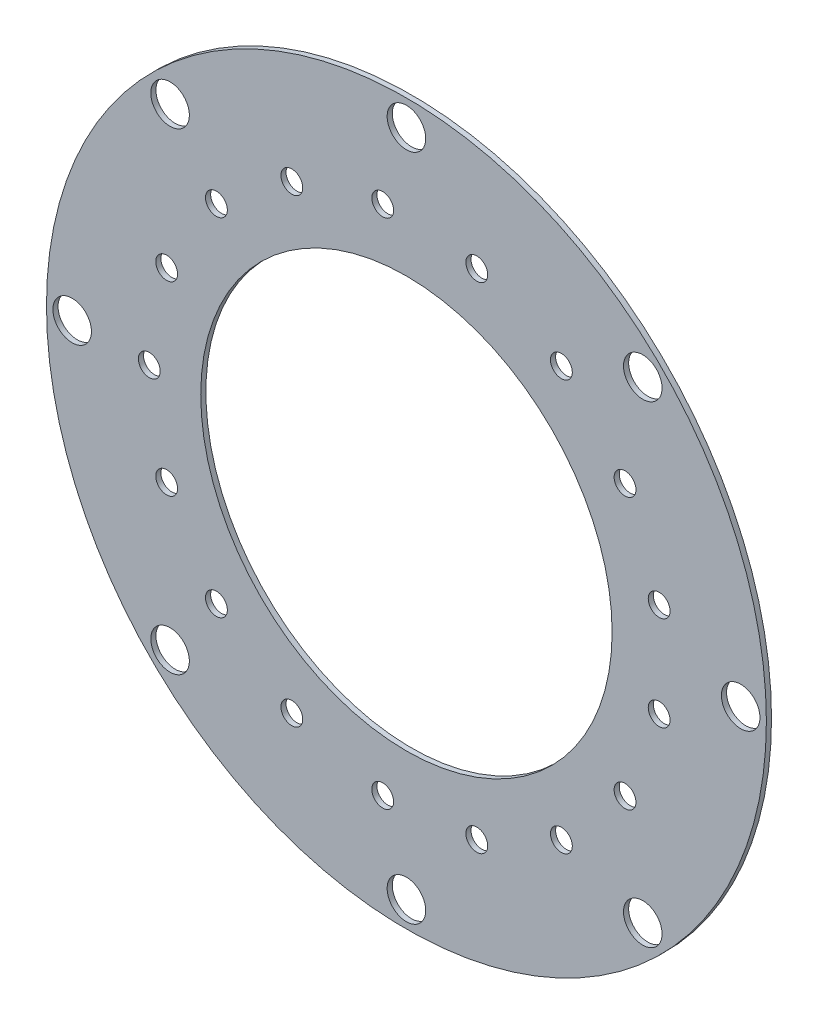
ISO-10303-21;
HEADER;
FILE_DESCRIPTION(('STEP AP214'),'2;1');
FILE_NAME('part.step','',(''),(''),'','','');
FILE_SCHEMA(('AUTOMOTIVE_DESIGN { 1 0 10303 214 1 1 1 1 }'));
ENDSEC;
DATA;
#1=APPLICATION_CONTEXT('core data for automotive mechanical design processes');
#2=APPLICATION_PROTOCOL_DEFINITION('international standard','automotive_design',2000,#1);
#3=PRODUCT_CONTEXT('',#1,'mechanical');
#4=PRODUCT('Part','Part','',(#3));
#5=PRODUCT_RELATED_PRODUCT_CATEGORY('part','',(#4));
#6=PRODUCT_DEFINITION_FORMATION('','',#4);
#7=PRODUCT_DEFINITION_CONTEXT('part definition',#1,'design');
#8=PRODUCT_DEFINITION('design','',#6,#7);
#9=PRODUCT_DEFINITION_SHAPE('','',#8);
#10=(LENGTH_UNIT() NAMED_UNIT(*) SI_UNIT(.MILLI.,.METRE.));
#11=(NAMED_UNIT(*) PLANE_ANGLE_UNIT() SI_UNIT($,.RADIAN.));
#12=(NAMED_UNIT(*) SI_UNIT($,.STERADIAN.) SOLID_ANGLE_UNIT());
#13=UNCERTAINTY_MEASURE_WITH_UNIT(LENGTH_MEASURE(1.E-05),#10,'distance_accuracy_value','');
#14=(GEOMETRIC_REPRESENTATION_CONTEXT(3) GLOBAL_UNCERTAINTY_ASSIGNED_CONTEXT((#13)) GLOBAL_UNIT_ASSIGNED_CONTEXT((#10,
#11,#12)) REPRESENTATION_CONTEXT('',''));
#15=CARTESIAN_POINT('',(0.,0.,0.));
#16=DIRECTION('',(0.,0.,1.));
#17=DIRECTION('',(1.,0.,0.));
#18=AXIS2_PLACEMENT_3D('',#15,#16,#17);
#19=CARTESIAN_POINT('',(0.,0.,-9.5));
#20=DIRECTION('',(0.,0.,1.));
#21=DIRECTION('',(1.,0.,0.));
#22=AXIS2_PLACEMENT_3D('',#19,#20,#21);
#23=PLANE('',#22);
#24=CARTESIAN_POINT('',(-2.26946287024804E-13,65.,-9.5));
#25=DIRECTION('',(0.,0.,-1.));
#26=DIRECTION('',(0.,-1.,0.));
#27=AXIS2_PLACEMENT_3D('',#24,#25,#26);
#28=CIRCLE('',#27,3.75);
#29=CARTESIAN_POINT('',(-2.13853232004142E-13,61.25,-9.5));
#30=VERTEX_POINT('',#29);
#31=EDGE_CURVE('E135',#30,#30,#28,.T.);
#32=ORIENTED_EDGE('',*,*,#31,.F.);
#33=EDGE_LOOP('',(#32));
#34=FACE_BOUND('',#33,.T.);
#35=CARTESIAN_POINT('',(-45.9619407771258,45.9619407771253,-9.5));
#36=DIRECTION('',(0.,0.,-1.));
#37=DIRECTION('',(0.707106781186551,-0.707106781186544,0.));
#38=AXIS2_PLACEMENT_3D('',#35,#36,#37);
#39=CIRCLE('',#38,3.75);
#40=CARTESIAN_POINT('',(-43.3102903476763,43.3102903476758,-9.5));
#41=VERTEX_POINT('',#40);
#42=EDGE_CURVE('E145',#41,#41,#39,.T.);
#43=ORIENTED_EDGE('',*,*,#42,.F.);
#44=EDGE_LOOP('',(#43));
#45=FACE_BOUND('',#44,.T.);
#46=CARTESIAN_POINT('',(-65.,0.,-9.5));
#47=DIRECTION('',(0.,0.,-1.));
#48=DIRECTION('',(1.,0.,0.));
#49=AXIS2_PLACEMENT_3D('',#46,#47,#48);
#50=CIRCLE('',#49,3.75);
#51=CARTESIAN_POINT('',(-61.25,0.,-9.5));
#52=VERTEX_POINT('',#51);
#53=EDGE_CURVE('E140',#52,#52,#50,.T.);
#54=ORIENTED_EDGE('',*,*,#53,.F.);
#55=EDGE_LOOP('',(#54));
#56=FACE_BOUND('',#55,.T.);
#57=CARTESIAN_POINT('',(-45.9619407771252,-45.961940777126,-9.5));
#58=DIRECTION('',(0.,0.,-1.));
#59=DIRECTION('',(0.707106781186541,0.707106781186554,0.));
#60=AXIS2_PLACEMENT_3D('',#57,#58,#59);
#61=CIRCLE('',#60,3.75);
#62=CARTESIAN_POINT('',(-43.3102903476757,-43.3102903476764,-9.5));
#63=VERTEX_POINT('',#62);
#64=EDGE_CURVE('E136',#63,#63,#61,.T.);
#65=ORIENTED_EDGE('',*,*,#64,.F.);
#66=EDGE_LOOP('',(#65));
#67=FACE_BOUND('',#66,.T.);
#68=CARTESIAN_POINT('',(6.80838861074411E-13,-65.,-9.5));
#69=DIRECTION('',(0.,0.,-1.));
#70=DIRECTION('',(0.,1.,0.));
#71=AXIS2_PLACEMENT_3D('',#68,#69,#70);
#72=CIRCLE('',#71,3.75);
#73=CARTESIAN_POINT('',(6.41559696012426E-13,-61.25,-9.5));
#74=VERTEX_POINT('',#73);
#75=EDGE_CURVE('E141',#74,#74,#72,.T.);
#76=ORIENTED_EDGE('',*,*,#75,.F.);
#77=EDGE_LOOP('',(#76));
#78=FACE_BOUND('',#77,.T.);
#79=CARTESIAN_POINT('',(45.9619407771261,-45.961940777125,-9.5));
#80=DIRECTION('',(0.,0.,-1.));
#81=DIRECTION('',(-0.707106781186556,0.707106781186539,0.));
#82=AXIS2_PLACEMENT_3D('',#79,#80,#81);
#83=CIRCLE('',#82,3.75);
#84=CARTESIAN_POINT('',(43.3102903476766,-43.3102903476755,-9.5));
#85=VERTEX_POINT('',#84);
#86=EDGE_CURVE('E152',#85,#85,#83,.T.);
#87=ORIENTED_EDGE('',*,*,#86,.F.);
#88=EDGE_LOOP('',(#87));
#89=FACE_BOUND('',#88,.T.);
#90=CARTESIAN_POINT('',(45.9619407771255,45.9619407771257,-9.5));
#91=DIRECTION('',(0.,0.,-1.));
#92=DIRECTION('',(-0.707106781186546,-0.707106781186549,0.));
#93=AXIS2_PLACEMENT_3D('',#90,#91,#92);
#94=CIRCLE('',#93,3.75);
#95=CARTESIAN_POINT('',(43.310290347676,43.3102903476761,-9.5));
#96=VERTEX_POINT('',#95);
#97=EDGE_CURVE('E131',#96,#96,#94,.T.);
#98=ORIENTED_EDGE('',*,*,#97,.F.);
#99=EDGE_LOOP('',(#98));
#100=FACE_BOUND('',#99,.T.);
#101=CARTESIAN_POINT('',(0.,0.,-9.5));
#102=DIRECTION('',(0.,0.,1.));
#103=DIRECTION('',(1.,0.,0.));
#104=AXIS2_PLACEMENT_3D('',#101,#102,#103);
#105=CIRCLE('',#104,40.);
#106=CARTESIAN_POINT('',(40.,0.,-9.5));
#107=VERTEX_POINT('',#106);
#108=EDGE_CURVE('E69',#107,#107,#105,.T.);
#109=ORIENTED_EDGE('',*,*,#108,.T.);
#110=EDGE_LOOP('',(#109));
#111=FACE_BOUND('',#110,.T.);
#112=CARTESIAN_POINT('',(-46.623611470218,18.062083309357,-9.5));
#113=DIRECTION('',(0.,0.,1.));
#114=DIRECTION('',(0.932472229404361,-0.361241666187141,0.));
#115=AXIS2_PLACEMENT_3D('',#112,#113,#114);
#116=CIRCLE('',#115,2.125);
#117=CARTESIAN_POINT('',(-44.6421079827338,17.2944447687094,-9.5));
#118=VERTEX_POINT('',#117);
#119=EDGE_CURVE('E64',#118,#118,#116,.T.);
#120=ORIENTED_EDGE('',*,*,#119,.T.);
#121=EDGE_LOOP('',(#120));
#122=FACE_BOUND('',#121,.T.);
#123=CARTESIAN_POINT('',(-36.9504458610334,33.6847821823274,-9.5));
#124=DIRECTION('',(0.,0.,1.));
#125=DIRECTION('',(0.739008917220668,-0.673695643646548,0.));
#126=AXIS2_PLACEMENT_3D('',#123,#124,#125);
#127=CIRCLE('',#126,2.125);
#128=CARTESIAN_POINT('',(-35.3800519119395,32.2531789395785,-9.5));
#129=VERTEX_POINT('',#128);
#130=EDGE_CURVE('E68',#129,#129,#127,.T.);
#131=ORIENTED_EDGE('',*,*,#130,.T.);
#132=EDGE_LOOP('',(#131));
#133=FACE_BOUND('',#132,.T.);
#134=CARTESIAN_POINT('',(-22.2869177888274,44.7581645677529,-9.5));
#135=DIRECTION('',(0.,0.,1.));
#136=DIRECTION('',(0.445738355776549,-0.895163291355057,0.));
#137=AXIS2_PLACEMENT_3D('',#134,#135,#136);
#138=CIRCLE('',#137,2.125);
#139=CARTESIAN_POINT('',(-21.3397237828023,42.8559425736234,-9.5));
#140=VERTEX_POINT('',#139);
#141=EDGE_CURVE('E73',#140,#140,#138,.T.);
#142=ORIENTED_EDGE('',*,*,#141,.T.);
#143=EDGE_LOOP('',(#142));
#144=FACE_BOUND('',#143,.T.);
#145=CARTESIAN_POINT('',(-4.61341797316565,49.7867088147517,-9.5));
#146=DIRECTION('',(0.,0.,1.));
#147=DIRECTION('',(0.092268359463313,-0.995734176295033,0.));
#148=AXIS2_PLACEMENT_3D('',#145,#146,#147);
#149=CIRCLE('',#148,2.125);
#150=CARTESIAN_POINT('',(-4.41734770930611,47.6707736901247,-9.5));
#151=VERTEX_POINT('',#150);
#152=EDGE_CURVE('E77',#151,#151,#149,.T.);
#153=ORIENTED_EDGE('',*,*,#152,.T.);
#154=EDGE_LOOP('',(#153));
#155=FACE_BOUND('',#154,.T.);
#156=CARTESIAN_POINT('',(13.6831495036036,48.0912821586411,-9.5));
#157=DIRECTION('',(0.,0.,1.));
#158=DIRECTION('',(-0.273662990072073,-0.961825643172822,0.));
#159=AXIS2_PLACEMENT_3D('',#156,#157,#158);
#160=CIRCLE('',#159,2.125);
#161=CARTESIAN_POINT('',(13.1016156497005,46.0474026668988,-9.5));
#162=VERTEX_POINT('',#161);
#163=EDGE_CURVE('E81',#162,#162,#160,.T.);
#164=ORIENTED_EDGE('',*,*,#163,.T.);
#165=EDGE_LOOP('',(#164));
#166=FACE_BOUND('',#165,.T.);
#167=CARTESIAN_POINT('',(30.1317318189625,39.9008613640122,-9.5));
#168=DIRECTION('',(0.,0.,1.));
#169=DIRECTION('',(-0.602634636379249,-0.798017227280245,0.));
#170=AXIS2_PLACEMENT_3D('',#167,#168,#169);
#171=CIRCLE('',#170,2.125);
#172=CARTESIAN_POINT('',(28.8511332166566,38.2050747560417,-9.5));
#173=VERTEX_POINT('',#172);
#174=EDGE_CURVE('E85',#173,#173,#171,.T.);
#175=ORIENTED_EDGE('',*,*,#174,.T.);
#176=EDGE_LOOP('',(#175));
#177=FACE_BOUND('',#176,.T.);
#178=CARTESIAN_POINT('',(42.5108567864805,26.3216081438681,-9.5));
#179=DIRECTION('',(0.,0.,1.));
#180=DIRECTION('',(-0.85021713572961,-0.526432162877363,0.));
#181=AXIS2_PLACEMENT_3D('',#178,#179,#180);
#182=CIRCLE('',#181,2.125);
#183=CARTESIAN_POINT('',(40.7041453730551,25.2029397977537,-9.5));
#184=VERTEX_POINT('',#183);
#185=EDGE_CURVE('E89',#184,#184,#182,.T.);
#186=ORIENTED_EDGE('',*,*,#185,.T.);
#187=EDGE_LOOP('',(#186));
#188=FACE_BOUND('',#187,.T.);
#189=CARTESIAN_POINT('',(49.148654984195,9.18747589082888,-9.5));
#190=DIRECTION('',(0.,0.,1.));
#191=DIRECTION('',(-0.9829730996839,-0.183749517816578,0.));
#192=AXIS2_PLACEMENT_3D('',#189,#190,#191);
#193=CIRCLE('',#192,2.125);
#194=CARTESIAN_POINT('',(47.0598371473667,8.79700816546865,-9.5));
#195=VERTEX_POINT('',#194);
#196=EDGE_CURVE('E93',#195,#195,#193,.T.);
#197=ORIENTED_EDGE('',*,*,#196,.T.);
#198=EDGE_LOOP('',(#197));
#199=FACE_BOUND('',#198,.T.);
#200=CARTESIAN_POINT('',(49.1486549841952,-9.18747589082819,-9.5));
#201=DIRECTION('',(0.,0.,1.));
#202=DIRECTION('',(-0.982973099683903,0.183749517816564,0.));
#203=AXIS2_PLACEMENT_3D('',#200,#201,#202);
#204=CIRCLE('',#203,2.125);
#205=CARTESIAN_POINT('',(47.0598371473669,-8.79700816546799,-9.5));
#206=VERTEX_POINT('',#205);
#207=EDGE_CURVE('E97',#206,#206,#204,.T.);
#208=ORIENTED_EDGE('',*,*,#207,.T.);
#209=EDGE_LOOP('',(#208));
#210=FACE_BOUND('',#209,.T.);
#211=CARTESIAN_POINT('',(42.5108567864809,-26.3216081438675,-9.5));
#212=DIRECTION('',(0.,0.,1.));
#213=DIRECTION('',(-0.850217135729617,0.526432162877351,0.));
#214=AXIS2_PLACEMENT_3D('',#211,#212,#213);
#215=CIRCLE('',#214,2.125);
#216=CARTESIAN_POINT('',(40.7041453730554,-25.2029397977532,-9.5));
#217=VERTEX_POINT('',#216);
#218=EDGE_CURVE('E101',#217,#217,#215,.T.);
#219=ORIENTED_EDGE('',*,*,#218,.T.);
#220=EDGE_LOOP('',(#219));
#221=FACE_BOUND('',#220,.T.);
#222=CARTESIAN_POINT('',(30.131731818963,-39.9008613640118,-9.5));
#223=DIRECTION('',(0.,0.,1.));
#224=DIRECTION('',(-0.602634636379261,0.798017227280236,0.));
#225=AXIS2_PLACEMENT_3D('',#222,#223,#224);
#226=CIRCLE('',#225,2.125);
#227=CARTESIAN_POINT('',(28.8511332166571,-38.2050747560413,-9.5));
#228=VERTEX_POINT('',#227);
#229=EDGE_CURVE('E105',#228,#228,#226,.T.);
#230=ORIENTED_EDGE('',*,*,#229,.T.);
#231=EDGE_LOOP('',(#230));
#232=FACE_BOUND('',#231,.T.);
#233=CARTESIAN_POINT('',(13.6831495036043,-48.0912821586409,-9.5));
#234=DIRECTION('',(0.,0.,1.));
#235=DIRECTION('',(-0.273662990072087,0.961825643172818,0.));
#236=AXIS2_PLACEMENT_3D('',#233,#234,#235);
#237=CIRCLE('',#236,2.125);
#238=CARTESIAN_POINT('',(13.1016156497012,-46.0474026668987,-9.5));
#239=VERTEX_POINT('',#238);
#240=EDGE_CURVE('E109',#239,#239,#237,.T.);
#241=ORIENTED_EDGE('',*,*,#240,.T.);
#242=EDGE_LOOP('',(#241));
#243=FACE_BOUND('',#242,.T.);
#244=CARTESIAN_POINT('',(-4.61341797316494,-49.7867088147517,-9.5));
#245=DIRECTION('',(0.,0.,1.));
#246=DIRECTION('',(0.0922683594632987,0.995734176295035,0.));
#247=AXIS2_PLACEMENT_3D('',#244,#245,#246);
#248=CIRCLE('',#247,2.125);
#249=CARTESIAN_POINT('',(-4.41734770930543,-47.6707736901248,-9.5));
#250=VERTEX_POINT('',#249);
#251=EDGE_CURVE('E113',#250,#250,#248,.T.);
#252=ORIENTED_EDGE('',*,*,#251,.T.);
#253=EDGE_LOOP('',(#252));
#254=FACE_BOUND('',#253,.T.);
#255=CARTESIAN_POINT('',(-22.2869177888268,-44.7581645677532,-9.5));
#256=DIRECTION('',(0.,0.,1.));
#257=DIRECTION('',(0.445738355776536,0.895163291355063,0.));
#258=AXIS2_PLACEMENT_3D('',#255,#256,#257);
#259=CIRCLE('',#258,2.125);
#260=CARTESIAN_POINT('',(-21.3397237828017,-42.8559425736237,-9.5));
#261=VERTEX_POINT('',#260);
#262=EDGE_CURVE('E117',#261,#261,#259,.T.);
#263=ORIENTED_EDGE('',*,*,#262,.T.);
#264=EDGE_LOOP('',(#263));
#265=FACE_BOUND('',#264,.T.);
#266=CARTESIAN_POINT('',(-36.9504458610329,-33.6847821823279,-9.5));
#267=DIRECTION('',(0.,0.,1.));
#268=DIRECTION('',(0.739008917220658,0.673695643646558,0.));
#269=AXIS2_PLACEMENT_3D('',#266,#267,#268);
#270=CIRCLE('',#269,2.125);
#271=CARTESIAN_POINT('',(-35.380051911939,-32.253178939579,-9.5));
#272=VERTEX_POINT('',#271);
#273=EDGE_CURVE('E63',#272,#272,#270,.T.);
#274=ORIENTED_EDGE('',*,*,#273,.T.);
#275=EDGE_LOOP('',(#274));
#276=FACE_BOUND('',#275,.T.);
#277=CARTESIAN_POINT('',(-46.6236114702178,-18.0620833093577,-9.5));
#278=DIRECTION('',(0.,0.,1.));
#279=DIRECTION('',(0.932472229404355,0.361241666187154,0.));
#280=AXIS2_PLACEMENT_3D('',#277,#278,#279);
#281=CIRCLE('',#280,2.125);
#282=CARTESIAN_POINT('',(-44.6421079827335,-17.29444476871,-9.5));
#283=VERTEX_POINT('',#282);
#284=EDGE_CURVE('E57',#283,#283,#281,.T.);
#285=ORIENTED_EDGE('',*,*,#284,.T.);
#286=EDGE_LOOP('',(#285));
#287=FACE_BOUND('',#286,.T.);
#288=CARTESIAN_POINT('',(-50.,0.,-9.5));
#289=DIRECTION('',(0.,0.,1.));
#290=DIRECTION('',(1.,0.,0.));
#291=AXIS2_PLACEMENT_3D('',#288,#289,#290);
#292=CIRCLE('',#291,2.125);
#293=CARTESIAN_POINT('',(-47.875,0.,-9.5));
#294=VERTEX_POINT('',#293);
#295=EDGE_CURVE('E52',#294,#294,#292,.T.);
#296=ORIENTED_EDGE('',*,*,#295,.T.);
#297=EDGE_LOOP('',(#296));
#298=FACE_BOUND('',#297,.T.);
#299=CARTESIAN_POINT('',(0.,0.,-9.5));
#300=DIRECTION('',(0.,0.,1.));
#301=DIRECTION('',(1.,0.,0.));
#302=AXIS2_PLACEMENT_3D('',#299,#300,#301);
#303=CIRCLE('',#302,70.);
#304=CARTESIAN_POINT('',(70.,0.,-9.5));
#305=VERTEX_POINT('',#304);
#306=EDGE_CURVE('E10',#305,#305,#303,.T.);
#307=ORIENTED_EDGE('',*,*,#306,.F.);
#308=EDGE_LOOP('',(#307));
#309=FACE_BOUND('',#308,.T.);
#310=CARTESIAN_POINT('',(65.,0.,-9.5));
#311=DIRECTION('',(0.,0.,-1.));
#312=DIRECTION('',(-1.,0.,0.));
#313=AXIS2_PLACEMENT_3D('',#310,#311,#312);
#314=CIRCLE('',#313,3.75);
#315=CARTESIAN_POINT('',(61.25,0.,-9.5));
#316=VERTEX_POINT('',#315);
#317=EDGE_CURVE('E127',#316,#316,#314,.T.);
#318=ORIENTED_EDGE('',*,*,#317,.F.);
#319=EDGE_LOOP('',(#318));
#320=FACE_BOUND('',#319,.T.);
#321=ADVANCED_FACE('F43',(#34,#45,#56,#67,#78,#89,#100,#111,#122,#133,#144,#155,#166,#177,#188,
#199,#210,#221,#232,#243,#254,#265,#276,#287,#298,#309,#320),#23,.F.);
#322=CARTESIAN_POINT('',(0.,0.,9.5));
#323=DIRECTION('',(0.,0.,-1.));
#324=DIRECTION('',(-1.,0.,0.));
#325=AXIS2_PLACEMENT_3D('',#322,#323,#324);
#326=CYLINDRICAL_SURFACE('',#325,70.);
#327=CARTESIAN_POINT('',(0.,0.,-8.5));
#328=DIRECTION('',(0.,0.,-1.));
#329=DIRECTION('',(-1.,0.,0.));
#330=AXIS2_PLACEMENT_3D('',#327,#328,#329);
#331=CIRCLE('',#330,70.);
#332=CARTESIAN_POINT('',(-70.,0.,-8.5));
#333=VERTEX_POINT('',#332);
#334=EDGE_CURVE('E156',#333,#333,#331,.T.);
#335=ORIENTED_EDGE('',*,*,#334,.T.);
#336=EDGE_LOOP('',(#335));
#337=FACE_BOUND('',#336,.T.);
#338=ORIENTED_EDGE('',*,*,#306,.T.);
#339=EDGE_LOOP('',(#338));
#340=FACE_BOUND('',#339,.T.);
#341=ADVANCED_FACE('F45',(#337,#340),#326,.T.);
#342=CARTESIAN_POINT('',(-50.,0.,-9.5));
#343=DIRECTION('',(0.,0.,1.));
#344=DIRECTION('',(1.,0.,0.));
#345=AXIS2_PLACEMENT_3D('',#342,#343,#344);
#346=CYLINDRICAL_SURFACE('',#345,2.125);
#347=CARTESIAN_POINT('',(-50.,0.,-8.5));
#348=DIRECTION('',(0.,0.,-1.));
#349=DIRECTION('',(-1.,0.,0.));
#350=AXIS2_PLACEMENT_3D('',#347,#348,#349);
#351=CIRCLE('',#350,2.125);
#352=CARTESIAN_POINT('',(-52.125,0.,-8.5));
#353=VERTEX_POINT('',#352);
#354=EDGE_CURVE('E163',#353,#353,#351,.F.);
#355=ORIENTED_EDGE('',*,*,#354,.T.);
#356=EDGE_LOOP('',(#355));
#357=FACE_BOUND('',#356,.T.);
#358=ORIENTED_EDGE('',*,*,#295,.F.);
#359=EDGE_LOOP('',(#358));
#360=FACE_BOUND('',#359,.T.);
#361=ADVANCED_FACE('F304',(#357,#360),#346,.F.);
#362=CARTESIAN_POINT('',(-46.6236114702178,-18.0620833093577,-9.5));
#363=DIRECTION('',(0.,0.,1.));
#364=DIRECTION('',(0.932472229404355,0.361241666187154,0.));
#365=AXIS2_PLACEMENT_3D('',#362,#363,#364);
#366=CYLINDRICAL_SURFACE('',#365,2.125);
#367=CARTESIAN_POINT('',(-46.6236114702178,-18.0620833093577,-8.5));
#368=DIRECTION('',(0.,0.,-1.));
#369=DIRECTION('',(-1.,0.,0.));
#370=AXIS2_PLACEMENT_3D('',#367,#368,#369);
#371=CIRCLE('',#370,2.125);
#372=CARTESIAN_POINT('',(-48.7486114702178,-18.0620833093577,-8.5));
#373=VERTEX_POINT('',#372);
#374=EDGE_CURVE('E167',#373,#373,#371,.F.);
#375=ORIENTED_EDGE('',*,*,#374,.T.);
#376=EDGE_LOOP('',(#375));
#377=FACE_BOUND('',#376,.T.);
#378=ORIENTED_EDGE('',*,*,#284,.F.);
#379=EDGE_LOOP('',(#378));
#380=FACE_BOUND('',#379,.T.);
#381=ADVANCED_FACE('F309',(#377,#380),#366,.F.);
#382=CARTESIAN_POINT('',(-36.9504458610329,-33.6847821823279,-9.5));
#383=DIRECTION('',(0.,0.,1.));
#384=DIRECTION('',(0.739008917220658,0.673695643646558,0.));
#385=AXIS2_PLACEMENT_3D('',#382,#383,#384);
#386=CYLINDRICAL_SURFACE('',#385,2.125);
#387=CARTESIAN_POINT('',(-36.9504458610329,-33.6847821823279,-8.5));
#388=DIRECTION('',(0.,0.,-1.));
#389=DIRECTION('',(-1.,0.,0.));
#390=AXIS2_PLACEMENT_3D('',#387,#388,#389);
#391=CIRCLE('',#390,2.125);
#392=CARTESIAN_POINT('',(-39.0754458610329,-33.6847821823279,-8.5));
#393=VERTEX_POINT('',#392);
#394=EDGE_CURVE('E171',#393,#393,#391,.F.);
#395=ORIENTED_EDGE('',*,*,#394,.T.);
#396=EDGE_LOOP('',(#395));
#397=FACE_BOUND('',#396,.T.);
#398=ORIENTED_EDGE('',*,*,#273,.F.);
#399=EDGE_LOOP('',(#398));
#400=FACE_BOUND('',#399,.T.);
#401=ADVANCED_FACE('F320',(#397,#400),#386,.F.);
#402=CARTESIAN_POINT('',(-22.2869177888268,-44.7581645677532,-9.5));
#403=DIRECTION('',(0.,0.,1.));
#404=DIRECTION('',(0.445738355776536,0.895163291355063,0.));
#405=AXIS2_PLACEMENT_3D('',#402,#403,#404);
#406=CYLINDRICAL_SURFACE('',#405,2.125);
#407=CARTESIAN_POINT('',(-22.2869177888268,-44.7581645677532,-8.5));
#408=DIRECTION('',(0.,0.,-1.));
#409=DIRECTION('',(-1.,0.,0.));
#410=AXIS2_PLACEMENT_3D('',#407,#408,#409);
#411=CIRCLE('',#410,2.125);
#412=CARTESIAN_POINT('',(-24.4119177888268,-44.7581645677532,-8.5));
#413=VERTEX_POINT('',#412);
#414=EDGE_CURVE('E175',#413,#413,#411,.F.);
#415=ORIENTED_EDGE('',*,*,#414,.T.);
#416=EDGE_LOOP('',(#415));
#417=FACE_BOUND('',#416,.T.);
#418=ORIENTED_EDGE('',*,*,#262,.F.);
#419=EDGE_LOOP('',(#418));
#420=FACE_BOUND('',#419,.T.);
#421=ADVANCED_FACE('F374',(#417,#420),#406,.F.);
#422=CARTESIAN_POINT('',(-4.61341797316494,-49.7867088147517,-9.5));
#423=DIRECTION('',(0.,0.,1.));
#424=DIRECTION('',(0.0922683594632987,0.995734176295035,0.));
#425=AXIS2_PLACEMENT_3D('',#422,#423,#424);
#426=CYLINDRICAL_SURFACE('',#425,2.125);
#427=CARTESIAN_POINT('',(-4.61341797316494,-49.7867088147517,-8.5));
#428=DIRECTION('',(0.,0.,-1.));
#429=DIRECTION('',(-1.,0.,0.));
#430=AXIS2_PLACEMENT_3D('',#427,#428,#429);
#431=CIRCLE('',#430,2.125);
#432=CARTESIAN_POINT('',(-6.73841797316494,-49.7867088147517,-8.5));
#433=VERTEX_POINT('',#432);
#434=EDGE_CURVE('E179',#433,#433,#431,.F.);
#435=ORIENTED_EDGE('',*,*,#434,.T.);
#436=EDGE_LOOP('',(#435));
#437=FACE_BOUND('',#436,.T.);
#438=ORIENTED_EDGE('',*,*,#251,.F.);
#439=EDGE_LOOP('',(#438));
#440=FACE_BOUND('',#439,.T.);
#441=ADVANCED_FACE('F370',(#437,#440),#426,.F.);
#442=CARTESIAN_POINT('',(13.6831495036043,-48.0912821586409,-9.5));
#443=DIRECTION('',(0.,0.,1.));
#444=DIRECTION('',(-0.273662990072087,0.961825643172818,0.));
#445=AXIS2_PLACEMENT_3D('',#442,#443,#444);
#446=CYLINDRICAL_SURFACE('',#445,2.125);
#447=CARTESIAN_POINT('',(13.6831495036043,-48.0912821586409,-8.5));
#448=DIRECTION('',(0.,0.,-1.));
#449=DIRECTION('',(-1.,0.,0.));
#450=AXIS2_PLACEMENT_3D('',#447,#448,#449);
#451=CIRCLE('',#450,2.125);
#452=CARTESIAN_POINT('',(11.5581495036043,-48.0912821586409,-8.5));
#453=VERTEX_POINT('',#452);
#454=EDGE_CURVE('E183',#453,#453,#451,.F.);
#455=ORIENTED_EDGE('',*,*,#454,.T.);
#456=EDGE_LOOP('',(#455));
#457=FACE_BOUND('',#456,.T.);
#458=ORIENTED_EDGE('',*,*,#240,.F.);
#459=EDGE_LOOP('',(#458));
#460=FACE_BOUND('',#459,.T.);
#461=ADVANCED_FACE('F366',(#457,#460),#446,.F.);
#462=CARTESIAN_POINT('',(30.131731818963,-39.9008613640118,-9.5));
#463=DIRECTION('',(0.,0.,1.));
#464=DIRECTION('',(-0.602634636379261,0.798017227280236,0.));
#465=AXIS2_PLACEMENT_3D('',#462,#463,#464);
#466=CYLINDRICAL_SURFACE('',#465,2.125);
#467=CARTESIAN_POINT('',(30.131731818963,-39.9008613640118,-8.5));
#468=DIRECTION('',(0.,0.,-1.));
#469=DIRECTION('',(-1.,0.,0.));
#470=AXIS2_PLACEMENT_3D('',#467,#468,#469);
#471=CIRCLE('',#470,2.125);
#472=CARTESIAN_POINT('',(28.006731818963,-39.9008613640118,-8.5));
#473=VERTEX_POINT('',#472);
#474=EDGE_CURVE('E187',#473,#473,#471,.F.);
#475=ORIENTED_EDGE('',*,*,#474,.T.);
#476=EDGE_LOOP('',(#475));
#477=FACE_BOUND('',#476,.T.);
#478=ORIENTED_EDGE('',*,*,#229,.F.);
#479=EDGE_LOOP('',(#478));
#480=FACE_BOUND('',#479,.T.);
#481=ADVANCED_FACE('F362',(#477,#480),#466,.F.);
#482=CARTESIAN_POINT('',(42.5108567864809,-26.3216081438675,-9.5));
#483=DIRECTION('',(0.,0.,1.));
#484=DIRECTION('',(-0.850217135729617,0.526432162877351,0.));
#485=AXIS2_PLACEMENT_3D('',#482,#483,#484);
#486=CYLINDRICAL_SURFACE('',#485,2.125);
#487=CARTESIAN_POINT('',(42.5108567864809,-26.3216081438675,-8.5));
#488=DIRECTION('',(0.,0.,-1.));
#489=DIRECTION('',(-1.,0.,0.));
#490=AXIS2_PLACEMENT_3D('',#487,#488,#489);
#491=CIRCLE('',#490,2.125);
#492=CARTESIAN_POINT('',(40.3858567864809,-26.3216081438675,-8.5));
#493=VERTEX_POINT('',#492);
#494=EDGE_CURVE('E191',#493,#493,#491,.F.);
#495=ORIENTED_EDGE('',*,*,#494,.T.);
#496=EDGE_LOOP('',(#495));
#497=FACE_BOUND('',#496,.T.);
#498=ORIENTED_EDGE('',*,*,#218,.F.);
#499=EDGE_LOOP('',(#498));
#500=FACE_BOUND('',#499,.T.);
#501=ADVANCED_FACE('F358',(#497,#500),#486,.F.);
#502=CARTESIAN_POINT('',(49.1486549841952,-9.18747589082819,-9.5));
#503=DIRECTION('',(0.,0.,1.));
#504=DIRECTION('',(-0.982973099683903,0.183749517816564,0.));
#505=AXIS2_PLACEMENT_3D('',#502,#503,#504);
#506=CYLINDRICAL_SURFACE('',#505,2.125);
#507=CARTESIAN_POINT('',(49.1486549841952,-9.18747589082819,-8.5));
#508=DIRECTION('',(0.,0.,-1.));
#509=DIRECTION('',(-1.,0.,0.));
#510=AXIS2_PLACEMENT_3D('',#507,#508,#509);
#511=CIRCLE('',#510,2.125);
#512=CARTESIAN_POINT('',(47.0236549841952,-9.18747589082819,-8.5));
#513=VERTEX_POINT('',#512);
#514=EDGE_CURVE('E195',#513,#513,#511,.F.);
#515=ORIENTED_EDGE('',*,*,#514,.T.);
#516=EDGE_LOOP('',(#515));
#517=FACE_BOUND('',#516,.T.);
#518=ORIENTED_EDGE('',*,*,#207,.F.);
#519=EDGE_LOOP('',(#518));
#520=FACE_BOUND('',#519,.T.);
#521=ADVANCED_FACE('F354',(#517,#520),#506,.F.);
#522=CARTESIAN_POINT('',(49.148654984195,9.18747589082888,-9.5));
#523=DIRECTION('',(0.,0.,1.));
#524=DIRECTION('',(-0.9829730996839,-0.183749517816578,0.));
#525=AXIS2_PLACEMENT_3D('',#522,#523,#524);
#526=CYLINDRICAL_SURFACE('',#525,2.125);
#527=CARTESIAN_POINT('',(49.148654984195,9.18747589082888,-8.5));
#528=DIRECTION('',(0.,0.,-1.));
#529=DIRECTION('',(-1.,0.,0.));
#530=AXIS2_PLACEMENT_3D('',#527,#528,#529);
#531=CIRCLE('',#530,2.125);
#532=CARTESIAN_POINT('',(47.023654984195,9.18747589082888,-8.5));
#533=VERTEX_POINT('',#532);
#534=EDGE_CURVE('E199',#533,#533,#531,.F.);
#535=ORIENTED_EDGE('',*,*,#534,.T.);
#536=EDGE_LOOP('',(#535));
#537=FACE_BOUND('',#536,.T.);
#538=ORIENTED_EDGE('',*,*,#196,.F.);
#539=EDGE_LOOP('',(#538));
#540=FACE_BOUND('',#539,.T.);
#541=ADVANCED_FACE('F350',(#537,#540),#526,.F.);
#542=CARTESIAN_POINT('',(42.5108567864805,26.3216081438681,-9.5));
#543=DIRECTION('',(0.,0.,1.));
#544=DIRECTION('',(-0.85021713572961,-0.526432162877363,0.));
#545=AXIS2_PLACEMENT_3D('',#542,#543,#544);
#546=CYLINDRICAL_SURFACE('',#545,2.125);
#547=CARTESIAN_POINT('',(42.5108567864805,26.3216081438681,-8.5));
#548=DIRECTION('',(0.,0.,-1.));
#549=DIRECTION('',(-1.,0.,0.));
#550=AXIS2_PLACEMENT_3D('',#547,#548,#549);
#551=CIRCLE('',#550,2.125);
#552=CARTESIAN_POINT('',(40.3858567864805,26.3216081438681,-8.5));
#553=VERTEX_POINT('',#552);
#554=EDGE_CURVE('E203',#553,#553,#551,.F.);
#555=ORIENTED_EDGE('',*,*,#554,.T.);
#556=EDGE_LOOP('',(#555));
#557=FACE_BOUND('',#556,.T.);
#558=ORIENTED_EDGE('',*,*,#185,.F.);
#559=EDGE_LOOP('',(#558));
#560=FACE_BOUND('',#559,.T.);
#561=ADVANCED_FACE('F346',(#557,#560),#546,.F.);
#562=CARTESIAN_POINT('',(30.1317318189625,39.9008613640122,-9.5));
#563=DIRECTION('',(0.,0.,1.));
#564=DIRECTION('',(-0.602634636379249,-0.798017227280245,0.));
#565=AXIS2_PLACEMENT_3D('',#562,#563,#564);
#566=CYLINDRICAL_SURFACE('',#565,2.125);
#567=CARTESIAN_POINT('',(30.1317318189625,39.9008613640122,-8.5));
#568=DIRECTION('',(0.,0.,-1.));
#569=DIRECTION('',(-1.,0.,0.));
#570=AXIS2_PLACEMENT_3D('',#567,#568,#569);
#571=CIRCLE('',#570,2.125);
#572=CARTESIAN_POINT('',(28.0067318189625,39.9008613640122,-8.5));
#573=VERTEX_POINT('',#572);
#574=EDGE_CURVE('E207',#573,#573,#571,.F.);
#575=ORIENTED_EDGE('',*,*,#574,.T.);
#576=EDGE_LOOP('',(#575));
#577=FACE_BOUND('',#576,.T.);
#578=ORIENTED_EDGE('',*,*,#174,.F.);
#579=EDGE_LOOP('',(#578));
#580=FACE_BOUND('',#579,.T.);
#581=ADVANCED_FACE('F342',(#577,#580),#566,.F.);
#582=CARTESIAN_POINT('',(13.6831495036036,48.0912821586411,-9.5));
#583=DIRECTION('',(0.,0.,1.));
#584=DIRECTION('',(-0.273662990072073,-0.961825643172822,0.));
#585=AXIS2_PLACEMENT_3D('',#582,#583,#584);
#586=CYLINDRICAL_SURFACE('',#585,2.125);
#587=CARTESIAN_POINT('',(13.6831495036036,48.0912821586411,-8.5));
#588=DIRECTION('',(0.,0.,-1.));
#589=DIRECTION('',(-1.,0.,0.));
#590=AXIS2_PLACEMENT_3D('',#587,#588,#589);
#591=CIRCLE('',#590,2.125);
#592=CARTESIAN_POINT('',(11.5581495036036,48.0912821586411,-8.5));
#593=VERTEX_POINT('',#592);
#594=EDGE_CURVE('E211',#593,#593,#591,.F.);
#595=ORIENTED_EDGE('',*,*,#594,.T.);
#596=EDGE_LOOP('',(#595));
#597=FACE_BOUND('',#596,.T.);
#598=ORIENTED_EDGE('',*,*,#163,.F.);
#599=EDGE_LOOP('',(#598));
#600=FACE_BOUND('',#599,.T.);
#601=ADVANCED_FACE('F338',(#597,#600),#586,.F.);
#602=CARTESIAN_POINT('',(-4.61341797316565,49.7867088147517,-9.5));
#603=DIRECTION('',(0.,0.,1.));
#604=DIRECTION('',(0.092268359463313,-0.995734176295033,0.));
#605=AXIS2_PLACEMENT_3D('',#602,#603,#604);
#606=CYLINDRICAL_SURFACE('',#605,2.125);
#607=CARTESIAN_POINT('',(-4.61341797316565,49.7867088147517,-8.5));
#608=DIRECTION('',(0.,0.,-1.));
#609=DIRECTION('',(-1.,0.,0.));
#610=AXIS2_PLACEMENT_3D('',#607,#608,#609);
#611=CIRCLE('',#610,2.125);
#612=CARTESIAN_POINT('',(-6.73841797316566,49.7867088147517,-8.5));
#613=VERTEX_POINT('',#612);
#614=EDGE_CURVE('E215',#613,#613,#611,.F.);
#615=ORIENTED_EDGE('',*,*,#614,.T.);
#616=EDGE_LOOP('',(#615));
#617=FACE_BOUND('',#616,.T.);
#618=ORIENTED_EDGE('',*,*,#152,.F.);
#619=EDGE_LOOP('',(#618));
#620=FACE_BOUND('',#619,.T.);
#621=ADVANCED_FACE('F334',(#617,#620),#606,.F.);
#622=CARTESIAN_POINT('',(-22.2869177888274,44.7581645677529,-9.5));
#623=DIRECTION('',(0.,0.,1.));
#624=DIRECTION('',(0.445738355776549,-0.895163291355057,0.));
#625=AXIS2_PLACEMENT_3D('',#622,#623,#624);
#626=CYLINDRICAL_SURFACE('',#625,2.125);
#627=CARTESIAN_POINT('',(-22.2869177888274,44.7581645677529,-8.5));
#628=DIRECTION('',(0.,0.,-1.));
#629=DIRECTION('',(-1.,0.,0.));
#630=AXIS2_PLACEMENT_3D('',#627,#628,#629);
#631=CIRCLE('',#630,2.125);
#632=CARTESIAN_POINT('',(-24.4119177888274,44.7581645677529,-8.5));
#633=VERTEX_POINT('',#632);
#634=EDGE_CURVE('E219',#633,#633,#631,.F.);
#635=ORIENTED_EDGE('',*,*,#634,.T.);
#636=EDGE_LOOP('',(#635));
#637=FACE_BOUND('',#636,.T.);
#638=ORIENTED_EDGE('',*,*,#141,.F.);
#639=EDGE_LOOP('',(#638));
#640=FACE_BOUND('',#639,.T.);
#641=ADVANCED_FACE('F330',(#637,#640),#626,.F.);
#642=CARTESIAN_POINT('',(-36.9504458610334,33.6847821823274,-9.5));
#643=DIRECTION('',(0.,0.,1.));
#644=DIRECTION('',(0.739008917220668,-0.673695643646548,0.));
#645=AXIS2_PLACEMENT_3D('',#642,#643,#644);
#646=CYLINDRICAL_SURFACE('',#645,2.125);
#647=CARTESIAN_POINT('',(-36.9504458610334,33.6847821823274,-8.5));
#648=DIRECTION('',(0.,0.,-1.));
#649=DIRECTION('',(-1.,0.,0.));
#650=AXIS2_PLACEMENT_3D('',#647,#648,#649);
#651=CIRCLE('',#650,2.125);
#652=CARTESIAN_POINT('',(-39.0754458610334,33.6847821823274,-8.5));
#653=VERTEX_POINT('',#652);
#654=EDGE_CURVE('E223',#653,#653,#651,.F.);
#655=ORIENTED_EDGE('',*,*,#654,.T.);
#656=EDGE_LOOP('',(#655));
#657=FACE_BOUND('',#656,.T.);
#658=ORIENTED_EDGE('',*,*,#130,.F.);
#659=EDGE_LOOP('',(#658));
#660=FACE_BOUND('',#659,.T.);
#661=ADVANCED_FACE('F326',(#657,#660),#646,.F.);
#662=CARTESIAN_POINT('',(-46.623611470218,18.062083309357,-9.5));
#663=DIRECTION('',(0.,0.,1.));
#664=DIRECTION('',(0.932472229404361,-0.361241666187141,0.));
#665=AXIS2_PLACEMENT_3D('',#662,#663,#664);
#666=CYLINDRICAL_SURFACE('',#665,2.125);
#667=CARTESIAN_POINT('',(-46.623611470218,18.062083309357,-8.5));
#668=DIRECTION('',(0.,0.,-1.));
#669=DIRECTION('',(-1.,0.,0.));
#670=AXIS2_PLACEMENT_3D('',#667,#668,#669);
#671=CIRCLE('',#670,2.125);
#672=CARTESIAN_POINT('',(-48.748611470218,18.062083309357,-8.5));
#673=VERTEX_POINT('',#672);
#674=EDGE_CURVE('E227',#673,#673,#671,.F.);
#675=ORIENTED_EDGE('',*,*,#674,.T.);
#676=EDGE_LOOP('',(#675));
#677=FACE_BOUND('',#676,.T.);
#678=ORIENTED_EDGE('',*,*,#119,.F.);
#679=EDGE_LOOP('',(#678));
#680=FACE_BOUND('',#679,.T.);
#681=ADVANCED_FACE('F322',(#677,#680),#666,.F.);
#682=CARTESIAN_POINT('',(0.,0.,-9.5));
#683=DIRECTION('',(0.,0.,1.));
#684=DIRECTION('',(1.,0.,0.));
#685=AXIS2_PLACEMENT_3D('',#682,#683,#684);
#686=CYLINDRICAL_SURFACE('',#685,40.);
#687=CARTESIAN_POINT('',(0.,0.,-8.5));
#688=DIRECTION('',(0.,0.,-1.));
#689=DIRECTION('',(-1.,0.,0.));
#690=AXIS2_PLACEMENT_3D('',#687,#688,#689);
#691=CIRCLE('',#690,40.);
#692=CARTESIAN_POINT('',(-40.,0.,-8.5));
#693=VERTEX_POINT('',#692);
#694=EDGE_CURVE('E231',#693,#693,#691,.F.);
#695=ORIENTED_EDGE('',*,*,#694,.T.);
#696=EDGE_LOOP('',(#695));
#697=FACE_BOUND('',#696,.T.);
#698=ORIENTED_EDGE('',*,*,#108,.F.);
#699=EDGE_LOOP('',(#698));
#700=FACE_BOUND('',#699,.T.);
#701=ADVANCED_FACE('F325',(#697,#700),#686,.F.);
#702=CARTESIAN_POINT('',(65.,0.,-9.5));
#703=DIRECTION('',(0.,0.,-1.));
#704=DIRECTION('',(-1.,0.,0.));
#705=AXIS2_PLACEMENT_3D('',#702,#703,#704);
#706=CYLINDRICAL_SURFACE('',#705,3.75);
#707=CARTESIAN_POINT('',(65.,0.,-8.5));
#708=DIRECTION('',(0.,0.,-1.));
#709=DIRECTION('',(-1.,0.,0.));
#710=AXIS2_PLACEMENT_3D('',#707,#708,#709);
#711=CIRCLE('',#710,3.75);
#712=CARTESIAN_POINT('',(61.25,0.,-8.5));
#713=VERTEX_POINT('',#712);
#714=EDGE_CURVE('E235',#713,#713,#711,.F.);
#715=ORIENTED_EDGE('',*,*,#714,.T.);
#716=EDGE_LOOP('',(#715));
#717=FACE_BOUND('',#716,.T.);
#718=ORIENTED_EDGE('',*,*,#317,.T.);
#719=EDGE_LOOP('',(#718));
#720=FACE_BOUND('',#719,.T.);
#721=ADVANCED_FACE('F384',(#717,#720),#706,.F.);
#722=CARTESIAN_POINT('',(45.9619407771255,45.9619407771257,-9.5));
#723=DIRECTION('',(0.,0.,-1.));
#724=DIRECTION('',(-0.707106781186546,-0.707106781186549,0.));
#725=AXIS2_PLACEMENT_3D('',#722,#723,#724);
#726=CYLINDRICAL_SURFACE('',#725,3.75);
#727=CARTESIAN_POINT('',(45.9619407771255,45.9619407771257,-8.5));
#728=DIRECTION('',(0.,0.,-1.));
#729=DIRECTION('',(-1.,0.,0.));
#730=AXIS2_PLACEMENT_3D('',#727,#728,#729);
#731=CIRCLE('',#730,3.75);
#732=CARTESIAN_POINT('',(42.2119407771255,45.9619407771257,-8.5));
#733=VERTEX_POINT('',#732);
#734=EDGE_CURVE('E239',#733,#733,#731,.F.);
#735=ORIENTED_EDGE('',*,*,#734,.T.);
#736=EDGE_LOOP('',(#735));
#737=FACE_BOUND('',#736,.T.);
#738=ORIENTED_EDGE('',*,*,#97,.T.);
#739=EDGE_LOOP('',(#738));
#740=FACE_BOUND('',#739,.T.);
#741=ADVANCED_FACE('F388',(#737,#740),#726,.F.);
#742=CARTESIAN_POINT('',(45.9619407771261,-45.961940777125,-9.5));
#743=DIRECTION('',(0.,0.,-1.));
#744=DIRECTION('',(-0.707106781186556,0.707106781186539,0.));
#745=AXIS2_PLACEMENT_3D('',#742,#743,#744);
#746=CYLINDRICAL_SURFACE('',#745,3.75);
#747=CARTESIAN_POINT('',(45.9619407771261,-45.961940777125,-8.5));
#748=DIRECTION('',(0.,0.,-1.));
#749=DIRECTION('',(-1.,0.,0.));
#750=AXIS2_PLACEMENT_3D('',#747,#748,#749);
#751=CIRCLE('',#750,3.75);
#752=CARTESIAN_POINT('',(42.2119407771261,-45.961940777125,-8.5));
#753=VERTEX_POINT('',#752);
#754=EDGE_CURVE('E243',#753,#753,#751,.F.);
#755=ORIENTED_EDGE('',*,*,#754,.T.);
#756=EDGE_LOOP('',(#755));
#757=FACE_BOUND('',#756,.T.);
#758=ORIENTED_EDGE('',*,*,#86,.T.);
#759=EDGE_LOOP('',(#758));
#760=FACE_BOUND('',#759,.T.);
#761=ADVANCED_FACE('F392',(#757,#760),#746,.F.);
#762=CARTESIAN_POINT('',(6.80838861074411E-13,-65.,-9.5));
#763=DIRECTION('',(0.,0.,-1.));
#764=DIRECTION('',(0.,1.,0.));
#765=AXIS2_PLACEMENT_3D('',#762,#763,#764);
#766=CYLINDRICAL_SURFACE('',#765,3.75);
#767=CARTESIAN_POINT('',(6.80838861074411E-13,-65.,-8.5));
#768=DIRECTION('',(0.,0.,-1.));
#769=DIRECTION('',(-1.,0.,0.));
#770=AXIS2_PLACEMENT_3D('',#767,#768,#769);
#771=CIRCLE('',#770,3.75);
#772=CARTESIAN_POINT('',(-3.74999999999932,-65.,-8.5));
#773=VERTEX_POINT('',#772);
#774=EDGE_CURVE('E247',#773,#773,#771,.F.);
#775=ORIENTED_EDGE('',*,*,#774,.T.);
#776=EDGE_LOOP('',(#775));
#777=FACE_BOUND('',#776,.T.);
#778=ORIENTED_EDGE('',*,*,#75,.T.);
#779=EDGE_LOOP('',(#778));
#780=FACE_BOUND('',#779,.T.);
#781=ADVANCED_FACE('F398',(#777,#780),#766,.F.);
#782=CARTESIAN_POINT('',(-45.9619407771252,-45.961940777126,-9.5));
#783=DIRECTION('',(0.,0.,-1.));
#784=DIRECTION('',(0.707106781186541,0.707106781186554,0.));
#785=AXIS2_PLACEMENT_3D('',#782,#783,#784);
#786=CYLINDRICAL_SURFACE('',#785,3.75);
#787=CARTESIAN_POINT('',(-45.9619407771252,-45.961940777126,-8.5));
#788=DIRECTION('',(0.,0.,-1.));
#789=DIRECTION('',(-1.,0.,0.));
#790=AXIS2_PLACEMENT_3D('',#787,#788,#789);
#791=CIRCLE('',#790,3.75);
#792=CARTESIAN_POINT('',(-49.7119407771252,-45.961940777126,-8.5));
#793=VERTEX_POINT('',#792);
#794=EDGE_CURVE('E251',#793,#793,#791,.F.);
#795=ORIENTED_EDGE('',*,*,#794,.T.);
#796=EDGE_LOOP('',(#795));
#797=FACE_BOUND('',#796,.T.);
#798=ORIENTED_EDGE('',*,*,#64,.T.);
#799=EDGE_LOOP('',(#798));
#800=FACE_BOUND('',#799,.T.);
#801=ADVANCED_FACE('F394',(#797,#800),#786,.F.);
#802=CARTESIAN_POINT('',(-65.,0.,-9.5));
#803=DIRECTION('',(0.,0.,-1.));
#804=DIRECTION('',(1.,0.,0.));
#805=AXIS2_PLACEMENT_3D('',#802,#803,#804);
#806=CYLINDRICAL_SURFACE('',#805,3.75);
#807=CARTESIAN_POINT('',(-65.,0.,-8.5));
#808=DIRECTION('',(0.,0.,-1.));
#809=DIRECTION('',(-1.,0.,0.));
#810=AXIS2_PLACEMENT_3D('',#807,#808,#809);
#811=CIRCLE('',#810,3.75);
#812=CARTESIAN_POINT('',(-68.75,0.,-8.5));
#813=VERTEX_POINT('',#812);
#814=EDGE_CURVE('E255',#813,#813,#811,.F.);
#815=ORIENTED_EDGE('',*,*,#814,.T.);
#816=EDGE_LOOP('',(#815));
#817=FACE_BOUND('',#816,.T.);
#818=ORIENTED_EDGE('',*,*,#53,.T.);
#819=EDGE_LOOP('',(#818));
#820=FACE_BOUND('',#819,.T.);
#821=ADVANCED_FACE('F397',(#817,#820),#806,.F.);
#822=CARTESIAN_POINT('',(-45.9619407771258,45.9619407771253,-9.5));
#823=DIRECTION('',(0.,0.,-1.));
#824=DIRECTION('',(0.707106781186551,-0.707106781186544,0.));
#825=AXIS2_PLACEMENT_3D('',#822,#823,#824);
#826=CYLINDRICAL_SURFACE('',#825,3.75);
#827=CARTESIAN_POINT('',(-45.9619407771258,45.9619407771253,-8.5));
#828=DIRECTION('',(0.,0.,-1.));
#829=DIRECTION('',(-1.,0.,0.));
#830=AXIS2_PLACEMENT_3D('',#827,#828,#829);
#831=CIRCLE('',#830,3.75);
#832=CARTESIAN_POINT('',(-49.7119407771258,45.9619407771253,-8.5));
#833=VERTEX_POINT('',#832);
#834=EDGE_CURVE('E259',#833,#833,#831,.F.);
#835=ORIENTED_EDGE('',*,*,#834,.T.);
#836=EDGE_LOOP('',(#835));
#837=FACE_BOUND('',#836,.T.);
#838=ORIENTED_EDGE('',*,*,#42,.T.);
#839=EDGE_LOOP('',(#838));
#840=FACE_BOUND('',#839,.T.);
#841=ADVANCED_FACE('F402',(#837,#840),#826,.F.);
#842=CARTESIAN_POINT('',(-2.26946287024804E-13,65.,-9.5));
#843=DIRECTION('',(0.,0.,-1.));
#844=DIRECTION('',(0.,-1.,0.));
#845=AXIS2_PLACEMENT_3D('',#842,#843,#844);
#846=CYLINDRICAL_SURFACE('',#845,3.75);
#847=CARTESIAN_POINT('',(-2.26946287024804E-13,65.,-8.5));
#848=DIRECTION('',(0.,0.,-1.));
#849=DIRECTION('',(-1.,0.,0.));
#850=AXIS2_PLACEMENT_3D('',#847,#848,#849);
#851=CIRCLE('',#850,3.75);
#852=CARTESIAN_POINT('',(-3.75000000000023,65.,-8.5));
#853=VERTEX_POINT('',#852);
#854=EDGE_CURVE('E47',#853,#853,#851,.F.);
#855=ORIENTED_EDGE('',*,*,#854,.T.);
#856=EDGE_LOOP('',(#855));
#857=FACE_BOUND('',#856,.T.);
#858=ORIENTED_EDGE('',*,*,#31,.T.);
#859=EDGE_LOOP('',(#858));
#860=FACE_BOUND('',#859,.T.);
#861=ADVANCED_FACE('F268',(#857,#860),#846,.F.);
#862=CARTESIAN_POINT('',(-78.4736934608006,-70.,-8.5));
#863=DIRECTION('',(0.,0.,-1.));
#864=DIRECTION('',(-1.,0.,0.));
#865=AXIS2_PLACEMENT_3D('',#862,#863,#864);
#866=PLANE('',#865);
#867=ORIENTED_EDGE('',*,*,#374,.F.);
#868=EDGE_LOOP('',(#867));
#869=FACE_BOUND('',#868,.T.);
#870=ORIENTED_EDGE('',*,*,#414,.F.);
#871=EDGE_LOOP('',(#870));
#872=FACE_BOUND('',#871,.T.);
#873=ORIENTED_EDGE('',*,*,#454,.F.);
#874=EDGE_LOOP('',(#873));
#875=FACE_BOUND('',#874,.T.);
#876=ORIENTED_EDGE('',*,*,#494,.F.);
#877=EDGE_LOOP('',(#876));
#878=FACE_BOUND('',#877,.T.);
#879=ORIENTED_EDGE('',*,*,#534,.F.);
#880=EDGE_LOOP('',(#879));
#881=FACE_BOUND('',#880,.T.);
#882=ORIENTED_EDGE('',*,*,#574,.F.);
#883=EDGE_LOOP('',(#882));
#884=FACE_BOUND('',#883,.T.);
#885=ORIENTED_EDGE('',*,*,#614,.F.);
#886=EDGE_LOOP('',(#885));
#887=FACE_BOUND('',#886,.T.);
#888=ORIENTED_EDGE('',*,*,#654,.F.);
#889=EDGE_LOOP('',(#888));
#890=FACE_BOUND('',#889,.T.);
#891=ORIENTED_EDGE('',*,*,#694,.F.);
#892=EDGE_LOOP('',(#891));
#893=FACE_BOUND('',#892,.T.);
#894=ORIENTED_EDGE('',*,*,#734,.F.);
#895=EDGE_LOOP('',(#894));
#896=FACE_BOUND('',#895,.T.);
#897=ORIENTED_EDGE('',*,*,#774,.F.);
#898=EDGE_LOOP('',(#897));
#899=FACE_BOUND('',#898,.T.);
#900=ORIENTED_EDGE('',*,*,#814,.F.);
#901=EDGE_LOOP('',(#900));
#902=FACE_BOUND('',#901,.T.);
#903=ORIENTED_EDGE('',*,*,#854,.F.);
#904=EDGE_LOOP('',(#903));
#905=FACE_BOUND('',#904,.T.);
#906=ORIENTED_EDGE('',*,*,#834,.F.);
#907=EDGE_LOOP('',(#906));
#908=FACE_BOUND('',#907,.T.);
#909=ORIENTED_EDGE('',*,*,#794,.F.);
#910=EDGE_LOOP('',(#909));
#911=FACE_BOUND('',#910,.T.);
#912=ORIENTED_EDGE('',*,*,#754,.F.);
#913=EDGE_LOOP('',(#912));
#914=FACE_BOUND('',#913,.T.);
#915=ORIENTED_EDGE('',*,*,#714,.F.);
#916=EDGE_LOOP('',(#915));
#917=FACE_BOUND('',#916,.T.);
#918=ORIENTED_EDGE('',*,*,#674,.F.);
#919=EDGE_LOOP('',(#918));
#920=FACE_BOUND('',#919,.T.);
#921=ORIENTED_EDGE('',*,*,#634,.F.);
#922=EDGE_LOOP('',(#921));
#923=FACE_BOUND('',#922,.T.);
#924=ORIENTED_EDGE('',*,*,#594,.F.);
#925=EDGE_LOOP('',(#924));
#926=FACE_BOUND('',#925,.T.);
#927=ORIENTED_EDGE('',*,*,#554,.F.);
#928=EDGE_LOOP('',(#927));
#929=FACE_BOUND('',#928,.T.);
#930=ORIENTED_EDGE('',*,*,#514,.F.);
#931=EDGE_LOOP('',(#930));
#932=FACE_BOUND('',#931,.T.);
#933=ORIENTED_EDGE('',*,*,#474,.F.);
#934=EDGE_LOOP('',(#933));
#935=FACE_BOUND('',#934,.T.);
#936=ORIENTED_EDGE('',*,*,#434,.F.);
#937=EDGE_LOOP('',(#936));
#938=FACE_BOUND('',#937,.T.);
#939=ORIENTED_EDGE('',*,*,#394,.F.);
#940=EDGE_LOOP('',(#939));
#941=FACE_BOUND('',#940,.T.);
#942=ORIENTED_EDGE('',*,*,#354,.F.);
#943=EDGE_LOOP('',(#942));
#944=FACE_BOUND('',#943,.T.);
#945=ORIENTED_EDGE('',*,*,#334,.F.);
#946=EDGE_LOOP('',(#945));
#947=FACE_BOUND('',#946,.T.);
#948=ADVANCED_FACE('F271',(#869,#872,#875,#878,#881,#884,#887,#890,#893,#896,#899,#902,#905,
#908,#911,#914,#917,#920,#923,#926,#929,#932,#935,#938,#941,#944,#947),#866,.F.);
#949=CLOSED_SHELL('',(#321,#341,#361,#381,#401,#421,#441,#461,#481,#501,#521,#541,#561,#581,
#601,#621,#641,#661,#681,#701,#721,#741,#761,#781,#801,#821,#841,#861,#948));
#950=MANIFOLD_SOLID_BREP('B2',#949);
#951=ADVANCED_BREP_SHAPE_REPRESENTATION('',(#18,#950),#14);
#952=SHAPE_DEFINITION_REPRESENTATION(#9,#951);
ENDSEC;
END-ISO-10303-21;
